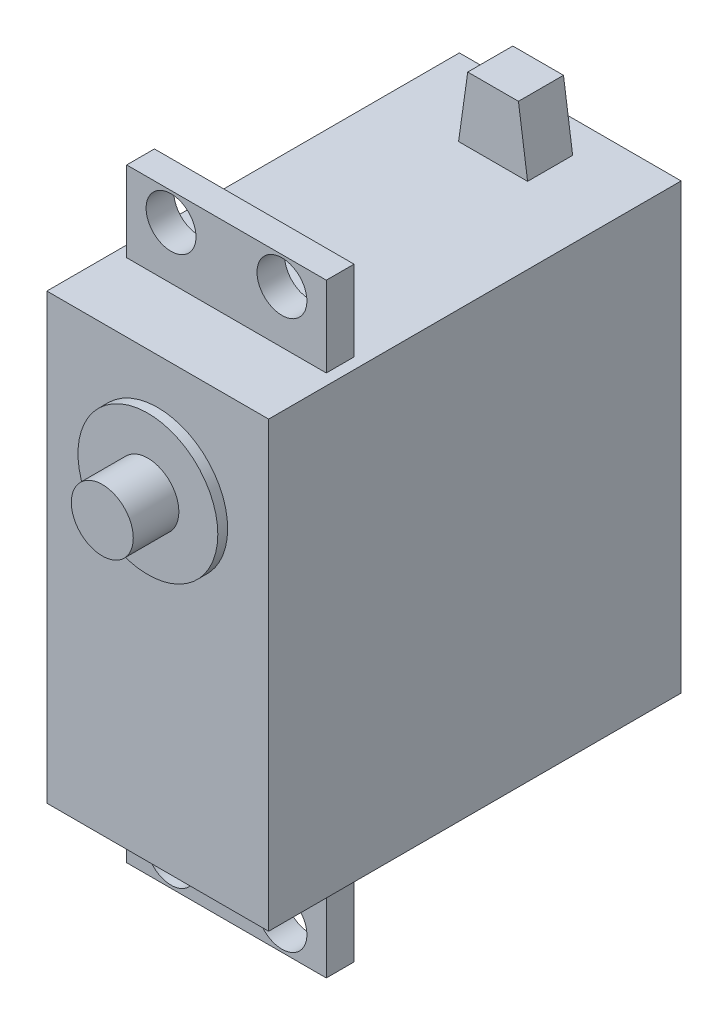
ISO-10303-21;
HEADER;
FILE_DESCRIPTION(('STEP AP214'),'2;1');
FILE_NAME('part.step','',(''),(''),'','','');
FILE_SCHEMA(('AUTOMOTIVE_DESIGN { 1 0 10303 214 1 1 1 1 }'));
ENDSEC;
DATA;
#1=APPLICATION_CONTEXT('core data for automotive mechanical design processes');
#2=APPLICATION_PROTOCOL_DEFINITION('international standard','automotive_design',2000,#1);
#3=PRODUCT_CONTEXT('',#1,'mechanical');
#4=PRODUCT('Part','Part','',(#3));
#5=PRODUCT_RELATED_PRODUCT_CATEGORY('part','',(#4));
#6=PRODUCT_DEFINITION_FORMATION('','',#4);
#7=PRODUCT_DEFINITION_CONTEXT('part definition',#1,'design');
#8=PRODUCT_DEFINITION('design','',#6,#7);
#9=PRODUCT_DEFINITION_SHAPE('','',#8);
#10=(LENGTH_UNIT() NAMED_UNIT(*) SI_UNIT(.MILLI.,.METRE.));
#11=(NAMED_UNIT(*) PLANE_ANGLE_UNIT() SI_UNIT($,.RADIAN.));
#12=(NAMED_UNIT(*) SI_UNIT($,.STERADIAN.) SOLID_ANGLE_UNIT());
#13=UNCERTAINTY_MEASURE_WITH_UNIT(LENGTH_MEASURE(1.E-05),#10,'distance_accuracy_value','');
#14=(GEOMETRIC_REPRESENTATION_CONTEXT(3) GLOBAL_UNCERTAINTY_ASSIGNED_CONTEXT((#13)) GLOBAL_UNIT_ASSIGNED_CONTEXT((#10,
#11,#12)) REPRESENTATION_CONTEXT('',''));
#15=CARTESIAN_POINT('',(0.,0.,0.));
#16=DIRECTION('',(0.,0.,1.));
#17=DIRECTION('',(1.,0.,0.));
#18=AXIS2_PLACEMENT_3D('',#15,#16,#17);
#19=CARTESIAN_POINT('',(0.,0.,8.7));
#20=DIRECTION('',(0.,0.,1.));
#21=DIRECTION('',(1.,0.,0.));
#22=AXIS2_PLACEMENT_3D('',#19,#20,#21);
#23=PLANE('',#22);
#24=CARTESIAN_POINT('',(10.,29.6,8.7));
#25=DIRECTION('',(0.,0.,1.));
#26=DIRECTION('',(1.,0.,0.));
#27=AXIS2_PLACEMENT_3D('',#24,#25,#26);
#28=CIRCLE('',#27,6.30555);
#29=CARTESIAN_POINT('',(16.30555,29.6,8.7));
#30=VERTEX_POINT('',#29);
#31=EDGE_CURVE('E365',#30,#30,#28,.T.);
#32=ORIENTED_EDGE('',*,*,#31,.F.);
#33=EDGE_LOOP('',(#32));
#34=FACE_BOUND('',#33,.T.);
#35=DIRECTION('',(0.,-1.,0.));
#36=VECTOR('',#35,1.);
#37=CARTESIAN_POINT('',(0.,40.,8.7));
#38=LINE('',#37,#36);
#39=CARTESIAN_POINT('',(0.,40.,8.7));
#40=VERTEX_POINT('',#39);
#41=CARTESIAN_POINT('',(0.,0.,8.7));
#42=VERTEX_POINT('',#41);
#43=EDGE_CURVE('E270',#40,#42,#38,.T.);
#44=ORIENTED_EDGE('',*,*,#43,.T.);
#45=DIRECTION('',(1.,0.,0.));
#46=VECTOR('',#45,1.);
#47=CARTESIAN_POINT('',(0.,0.,8.7));
#48=LINE('',#47,#46);
#49=CARTESIAN_POINT('',(20.,0.,8.7));
#50=VERTEX_POINT('',#49);
#51=EDGE_CURVE('E273',#42,#50,#48,.T.);
#52=ORIENTED_EDGE('',*,*,#51,.T.);
#53=DIRECTION('',(0.,1.,0.));
#54=VECTOR('',#53,1.);
#55=CARTESIAN_POINT('',(20.,40.,8.7));
#56=LINE('',#55,#54);
#57=CARTESIAN_POINT('',(20.,40.,8.7));
#58=VERTEX_POINT('',#57);
#59=EDGE_CURVE('E275',#50,#58,#56,.T.);
#60=ORIENTED_EDGE('',*,*,#59,.T.);
#61=DIRECTION('',(-1.,0.,0.));
#62=VECTOR('',#61,1.);
#63=CARTESIAN_POINT('',(0.,40.,8.7));
#64=LINE('',#63,#62);
#65=EDGE_CURVE('E277',#58,#40,#64,.T.);
#66=ORIENTED_EDGE('',*,*,#65,.T.);
#67=EDGE_LOOP('',(#44,#52,#60,#66));
#68=FACE_BOUND('',#67,.T.);
#69=ADVANCED_FACE('F36',(#34,#68),#23,.T.);
#70=CARTESIAN_POINT('',(0.,40.,8.7));
#71=DIRECTION('',(1.,0.,0.));
#72=DIRECTION('',(0.,1.,0.));
#73=AXIS2_PLACEMENT_3D('',#70,#71,#72);
#74=PLANE('',#73);
#75=DIRECTION('',(0.,0.,-1.));
#76=VECTOR('',#75,1.);
#77=CARTESIAN_POINT('',(0.,40.,8.7));
#78=LINE('',#77,#76);
#79=CARTESIAN_POINT('',(0.,40.,-28.5));
#80=VERTEX_POINT('',#79);
#81=EDGE_CURVE('E279',#40,#80,#78,.T.);
#82=ORIENTED_EDGE('',*,*,#81,.T.);
#83=DIRECTION('',(0.,1.,0.));
#84=VECTOR('',#83,1.);
#85=CARTESIAN_POINT('',(0.,40.,-28.5));
#86=LINE('',#85,#84);
#87=CARTESIAN_POINT('',(0.,0.,-28.5));
#88=VERTEX_POINT('',#87);
#89=EDGE_CURVE('E265',#88,#80,#86,.T.);
#90=ORIENTED_EDGE('',*,*,#89,.F.);
#91=DIRECTION('',(0.,0.,-1.));
#92=VECTOR('',#91,1.);
#93=CARTESIAN_POINT('',(0.,0.,8.7));
#94=LINE('',#93,#92);
#95=EDGE_CURVE('E286',#42,#88,#94,.T.);
#96=ORIENTED_EDGE('',*,*,#95,.F.);
#97=ORIENTED_EDGE('',*,*,#43,.F.);
#98=EDGE_LOOP('',(#82,#90,#96,#97));
#99=FACE_BOUND('',#98,.T.);
#100=ADVANCED_FACE('F38',(#99),#74,.F.);
#101=CARTESIAN_POINT('',(0.,0.,8.7));
#102=DIRECTION('',(0.,1.,0.));
#103=DIRECTION('',(0.,0.,1.));
#104=AXIS2_PLACEMENT_3D('',#101,#102,#103);
#105=PLANE('',#104);
#106=DIRECTION('',(0.,0.,-1.));
#107=VECTOR('',#106,1.);
#108=CARTESIAN_POINT('',(1.,0.,2.5));
#109=LINE('',#108,#107);
#110=CARTESIAN_POINT('',(1.,0.,2.5));
#111=VERTEX_POINT('',#110);
#112=CARTESIAN_POINT('',(1.,0.,0.));
#113=VERTEX_POINT('',#112);
#114=EDGE_CURVE('E56',#111,#113,#109,.T.);
#115=ORIENTED_EDGE('',*,*,#114,.F.);
#116=DIRECTION('',(1.,0.,0.));
#117=VECTOR('',#116,1.);
#118=CARTESIAN_POINT('',(0.,0.,2.5));
#119=LINE('',#118,#117);
#120=CARTESIAN_POINT('',(19.,0.,2.5));
#121=VERTEX_POINT('',#120);
#122=EDGE_CURVE('E257',#111,#121,#119,.T.);
#123=ORIENTED_EDGE('',*,*,#122,.T.);
#124=DIRECTION('',(0.,0.,-1.));
#125=VECTOR('',#124,1.);
#126=CARTESIAN_POINT('',(19.,0.,2.5));
#127=LINE('',#126,#125);
#128=CARTESIAN_POINT('',(19.,0.,0.));
#129=VERTEX_POINT('',#128);
#130=EDGE_CURVE('E224',#121,#129,#127,.T.);
#131=ORIENTED_EDGE('',*,*,#130,.T.);
#132=DIRECTION('',(1.,0.,0.));
#133=VECTOR('',#132,1.);
#134=CARTESIAN_POINT('',(0.,0.,0.));
#135=LINE('',#134,#133);
#136=EDGE_CURVE('E52',#113,#129,#135,.T.);
#137=ORIENTED_EDGE('',*,*,#136,.F.);
#138=EDGE_LOOP('',(#115,#123,#131,#137));
#139=FACE_BOUND('',#138,.T.);
#140=ORIENTED_EDGE('',*,*,#95,.T.);
#141=DIRECTION('',(-1.,0.,0.));
#142=VECTOR('',#141,1.);
#143=CARTESIAN_POINT('',(20.,0.,-28.5));
#144=LINE('',#143,#142);
#145=CARTESIAN_POINT('',(20.,0.,-28.5));
#146=VERTEX_POINT('',#145);
#147=EDGE_CURVE('E262',#146,#88,#144,.T.);
#148=ORIENTED_EDGE('',*,*,#147,.F.);
#149=DIRECTION('',(0.,0.,-1.));
#150=VECTOR('',#149,1.);
#151=CARTESIAN_POINT('',(20.,0.,8.7));
#152=LINE('',#151,#150);
#153=EDGE_CURVE('E284',#50,#146,#152,.T.);
#154=ORIENTED_EDGE('',*,*,#153,.F.);
#155=ORIENTED_EDGE('',*,*,#51,.F.);
#156=EDGE_LOOP('',(#140,#148,#154,#155));
#157=FACE_BOUND('',#156,.T.);
#158=ADVANCED_FACE('F332',(#139,#157),#105,.F.);
#159=CARTESIAN_POINT('',(20.,40.,8.7));
#160=DIRECTION('',(-1.,0.,0.));
#161=DIRECTION('',(0.,0.,1.));
#162=AXIS2_PLACEMENT_3D('',#159,#160,#161);
#163=PLANE('',#162);
#164=ORIENTED_EDGE('',*,*,#153,.T.);
#165=DIRECTION('',(0.,-1.,0.));
#166=VECTOR('',#165,1.);
#167=CARTESIAN_POINT('',(20.,40.,-28.5));
#168=LINE('',#167,#166);
#169=CARTESIAN_POINT('',(20.,40.,-28.5));
#170=VERTEX_POINT('',#169);
#171=EDGE_CURVE('E259',#170,#146,#168,.T.);
#172=ORIENTED_EDGE('',*,*,#171,.F.);
#173=DIRECTION('',(0.,0.,-1.));
#174=VECTOR('',#173,1.);
#175=CARTESIAN_POINT('',(20.,40.,8.7));
#176=LINE('',#175,#174);
#177=EDGE_CURVE('E281',#58,#170,#176,.T.);
#178=ORIENTED_EDGE('',*,*,#177,.F.);
#179=ORIENTED_EDGE('',*,*,#59,.F.);
#180=EDGE_LOOP('',(#164,#172,#178,#179));
#181=FACE_BOUND('',#180,.T.);
#182=ADVANCED_FACE('F342',(#181),#163,.F.);
#183=CARTESIAN_POINT('',(0.,40.,8.7));
#184=DIRECTION('',(0.,-1.,0.));
#185=DIRECTION('',(1.,0.,0.));
#186=AXIS2_PLACEMENT_3D('',#183,#184,#185);
#187=PLANE('',#186);
#188=ORIENTED_EDGE('',*,*,#177,.T.);
#189=DIRECTION('',(1.,0.,0.));
#190=VECTOR('',#189,1.);
#191=CARTESIAN_POINT('',(20.,40.,-28.5));
#192=LINE('',#191,#190);
#193=EDGE_CURVE('E268',#80,#170,#192,.T.);
#194=ORIENTED_EDGE('',*,*,#193,.F.);
#195=ORIENTED_EDGE('',*,*,#81,.F.);
#196=ORIENTED_EDGE('',*,*,#65,.F.);
#197=EDGE_LOOP('',(#188,#194,#195,#196));
#198=FACE_BOUND('',#197,.T.);
#199=DIRECTION('',(-1.,0.,0.));
#200=VECTOR('',#199,1.);
#201=CARTESIAN_POINT('',(6.8885,40.,-25.6044));
#202=LINE('',#201,#200);
#203=CARTESIAN_POINT('',(13.1115,40.,-25.6044));
#204=VERTEX_POINT('',#203);
#205=CARTESIAN_POINT('',(6.8885,40.,-25.6044));
#206=VERTEX_POINT('',#205);
#207=EDGE_CURVE('E165',#204,#206,#202,.T.);
#208=ORIENTED_EDGE('',*,*,#207,.F.);
#209=DIRECTION('',(0.,0.,-1.));
#210=VECTOR('',#209,1.);
#211=CARTESIAN_POINT('',(13.1115,40.,-21.5404));
#212=LINE('',#211,#210);
#213=CARTESIAN_POINT('',(13.1115,40.,-21.5404));
#214=VERTEX_POINT('',#213);
#215=EDGE_CURVE('E164',#214,#204,#212,.T.);
#216=ORIENTED_EDGE('',*,*,#215,.F.);
#217=DIRECTION('',(-1.,0.,0.));
#218=VECTOR('',#217,1.);
#219=CARTESIAN_POINT('',(13.1115,40.,-21.5404));
#220=LINE('',#219,#218);
#221=CARTESIAN_POINT('',(6.8885,40.,-21.5404));
#222=VERTEX_POINT('',#221);
#223=EDGE_CURVE('E375',#214,#222,#220,.T.);
#224=ORIENTED_EDGE('',*,*,#223,.T.);
#225=DIRECTION('',(0.,0.,-1.));
#226=VECTOR('',#225,1.);
#227=CARTESIAN_POINT('',(6.8885,40.,-21.5404));
#228=LINE('',#227,#226);
#229=EDGE_CURVE('E177',#222,#206,#228,.T.);
#230=ORIENTED_EDGE('',*,*,#229,.T.);
#231=EDGE_LOOP('',(#208,#216,#224,#230));
#232=FACE_BOUND('',#231,.T.);
#233=DIRECTION('',(0.,0.,-1.));
#234=VECTOR('',#233,1.);
#235=CARTESIAN_POINT('',(19.,40.,2.5));
#236=LINE('',#235,#234);
#237=CARTESIAN_POINT('',(19.,40.,2.5));
#238=VERTEX_POINT('',#237);
#239=CARTESIAN_POINT('',(19.,40.,0.));
#240=VERTEX_POINT('',#239);
#241=EDGE_CURVE('E253',#238,#240,#236,.T.);
#242=ORIENTED_EDGE('',*,*,#241,.F.);
#243=DIRECTION('',(-1.,0.,0.));
#244=VECTOR('',#243,1.);
#245=CARTESIAN_POINT('',(0.,40.,2.5));
#246=LINE('',#245,#244);
#247=CARTESIAN_POINT('',(0.999999999999999,40.,2.5));
#248=VERTEX_POINT('',#247);
#249=EDGE_CURVE('E12',#238,#248,#246,.T.);
#250=ORIENTED_EDGE('',*,*,#249,.T.);
#251=DIRECTION('',(0.,0.,-1.));
#252=VECTOR('',#251,1.);
#253=CARTESIAN_POINT('',(0.999999999999999,40.,2.5));
#254=LINE('',#253,#252);
#255=CARTESIAN_POINT('',(0.999999999999999,40.,0.));
#256=VERTEX_POINT('',#255);
#257=EDGE_CURVE('E245',#248,#256,#254,.T.);
#258=ORIENTED_EDGE('',*,*,#257,.T.);
#259=DIRECTION('',(-1.,0.,0.));
#260=VECTOR('',#259,1.);
#261=CARTESIAN_POINT('',(0.,40.,0.));
#262=LINE('',#261,#260);
#263=EDGE_CURVE('E45',#240,#256,#262,.T.);
#264=ORIENTED_EDGE('',*,*,#263,.F.);
#265=EDGE_LOOP('',(#242,#250,#258,#264));
#266=FACE_BOUND('',#265,.T.);
#267=ADVANCED_FACE('F308',(#198,#232,#266),#187,.F.);
#268=CARTESIAN_POINT('',(0.,0.,-28.5));
#269=DIRECTION('',(0.,0.,-1.));
#270=DIRECTION('',(-1.,0.,0.));
#271=AXIS2_PLACEMENT_3D('',#268,#269,#270);
#272=PLANE('',#271);
#273=ORIENTED_EDGE('',*,*,#193,.T.);
#274=ORIENTED_EDGE('',*,*,#171,.T.);
#275=ORIENTED_EDGE('',*,*,#147,.T.);
#276=ORIENTED_EDGE('',*,*,#89,.T.);
#277=EDGE_LOOP('',(#273,#274,#275,#276));
#278=FACE_BOUND('',#277,.T.);
#279=ADVANCED_FACE('F338',(#278),#272,.T.);
#280=CARTESIAN_POINT('',(5.,44.75,2.5));
#281=DIRECTION('',(0.,0.,-1.));
#282=DIRECTION('',(-1.,0.,0.));
#283=AXIS2_PLACEMENT_3D('',#280,#281,#282);
#284=CYLINDRICAL_SURFACE('',#283,2.25);
#285=CARTESIAN_POINT('',(5.,44.75,2.5));
#286=DIRECTION('',(0.,0.,1.));
#287=DIRECTION('',(1.,0.,0.));
#288=AXIS2_PLACEMENT_3D('',#285,#286,#287);
#289=CIRCLE('',#288,2.25);
#290=CARTESIAN_POINT('',(7.25,44.75,2.5));
#291=VERTEX_POINT('',#290);
#292=EDGE_CURVE('E191',#291,#291,#289,.T.);
#293=ORIENTED_EDGE('',*,*,#292,.T.);
#294=EDGE_LOOP('',(#293));
#295=FACE_BOUND('',#294,.T.);
#296=CARTESIAN_POINT('',(5.,44.75,0.));
#297=DIRECTION('',(0.,0.,1.));
#298=DIRECTION('',(1.,0.,0.));
#299=AXIS2_PLACEMENT_3D('',#296,#297,#298);
#300=CIRCLE('',#299,2.25);
#301=CARTESIAN_POINT('',(7.25,44.75,0.));
#302=VERTEX_POINT('',#301);
#303=EDGE_CURVE('E188',#302,#302,#300,.T.);
#304=ORIENTED_EDGE('',*,*,#303,.F.);
#305=EDGE_LOOP('',(#304));
#306=FACE_BOUND('',#305,.T.);
#307=ADVANCED_FACE('F412',(#295,#306),#284,.F.);
#308=CARTESIAN_POINT('',(15.,44.75,2.5));
#309=DIRECTION('',(0.,0.,-1.));
#310=DIRECTION('',(-1.,0.,0.));
#311=AXIS2_PLACEMENT_3D('',#308,#309,#310);
#312=CYLINDRICAL_SURFACE('',#311,2.25);
#313=CARTESIAN_POINT('',(15.,44.75,2.5));
#314=DIRECTION('',(0.,0.,1.));
#315=DIRECTION('',(1.,0.,0.));
#316=AXIS2_PLACEMENT_3D('',#313,#314,#315);
#317=CIRCLE('',#316,2.25);
#318=CARTESIAN_POINT('',(17.25,44.75,2.5));
#319=VERTEX_POINT('',#318);
#320=EDGE_CURVE('E185',#319,#319,#317,.T.);
#321=ORIENTED_EDGE('',*,*,#320,.T.);
#322=EDGE_LOOP('',(#321));
#323=FACE_BOUND('',#322,.T.);
#324=CARTESIAN_POINT('',(15.,44.75,0.));
#325=DIRECTION('',(0.,0.,1.));
#326=DIRECTION('',(1.,0.,0.));
#327=AXIS2_PLACEMENT_3D('',#324,#325,#326);
#328=CIRCLE('',#327,2.25);
#329=CARTESIAN_POINT('',(17.25,44.75,0.));
#330=VERTEX_POINT('',#329);
#331=EDGE_CURVE('E175',#330,#330,#328,.T.);
#332=ORIENTED_EDGE('',*,*,#331,.F.);
#333=EDGE_LOOP('',(#332));
#334=FACE_BOUND('',#333,.T.);
#335=ADVANCED_FACE('F409',(#323,#334),#312,.F.);
#336=CARTESIAN_POINT('',(1.,47.25,2.5));
#337=DIRECTION('',(0.,-1.,0.));
#338=DIRECTION('',(0.,0.,-1.));
#339=AXIS2_PLACEMENT_3D('',#336,#337,#338);
#340=PLANE('',#339);
#341=DIRECTION('',(-1.,0.,0.));
#342=VECTOR('',#341,1.);
#343=CARTESIAN_POINT('',(1.,47.25,0.));
#344=LINE('',#343,#342);
#345=CARTESIAN_POINT('',(19.,47.25,0.));
#346=VERTEX_POINT('',#345);
#347=CARTESIAN_POINT('',(1.,47.25,0.));
#348=VERTEX_POINT('',#347);
#349=EDGE_CURVE('E226',#346,#348,#344,.T.);
#350=ORIENTED_EDGE('',*,*,#349,.T.);
#351=DIRECTION('',(0.,0.,-1.));
#352=VECTOR('',#351,1.);
#353=CARTESIAN_POINT('',(1.,47.25,2.5));
#354=LINE('',#353,#352);
#355=CARTESIAN_POINT('',(1.,47.25,2.5));
#356=VERTEX_POINT('',#355);
#357=EDGE_CURVE('E247',#356,#348,#354,.T.);
#358=ORIENTED_EDGE('',*,*,#357,.F.);
#359=DIRECTION('',(-1.,0.,0.));
#360=VECTOR('',#359,1.);
#361=CARTESIAN_POINT('',(1.,47.25,2.5));
#362=LINE('',#361,#360);
#363=CARTESIAN_POINT('',(19.,47.25,2.5));
#364=VERTEX_POINT('',#363);
#365=EDGE_CURVE('E211',#364,#356,#362,.T.);
#366=ORIENTED_EDGE('',*,*,#365,.F.);
#367=DIRECTION('',(0.,0.,-1.));
#368=VECTOR('',#367,1.);
#369=CARTESIAN_POINT('',(19.,47.25,2.5));
#370=LINE('',#369,#368);
#371=EDGE_CURVE('E250',#364,#346,#370,.T.);
#372=ORIENTED_EDGE('',*,*,#371,.T.);
#373=EDGE_LOOP('',(#350,#358,#366,#372));
#374=FACE_BOUND('',#373,.T.);
#375=ADVANCED_FACE('F302',(#374),#340,.F.);
#376=CARTESIAN_POINT('',(1.,47.25,2.5));
#377=DIRECTION('',(1.,0.,0.));
#378=DIRECTION('',(0.,1.,0.));
#379=AXIS2_PLACEMENT_3D('',#376,#377,#378);
#380=PLANE('',#379);
#381=DIRECTION('',(0.,-1.,0.));
#382=VECTOR('',#381,1.);
#383=CARTESIAN_POINT('',(1.,47.25,0.));
#384=LINE('',#383,#382);
#385=EDGE_CURVE('E228',#348,#256,#384,.T.);
#386=ORIENTED_EDGE('',*,*,#385,.T.);
#387=ORIENTED_EDGE('',*,*,#257,.F.);
#388=DIRECTION('',(0.,-1.,0.));
#389=VECTOR('',#388,1.);
#390=CARTESIAN_POINT('',(1.,47.25,2.5));
#391=LINE('',#390,#389);
#392=EDGE_CURVE('E214',#356,#248,#391,.T.);
#393=ORIENTED_EDGE('',*,*,#392,.F.);
#394=ORIENTED_EDGE('',*,*,#357,.T.);
#395=EDGE_LOOP('',(#386,#387,#393,#394));
#396=FACE_BOUND('',#395,.T.);
#397=ADVANCED_FACE('F297',(#396),#380,.F.);
#398=CARTESIAN_POINT('',(19.,47.25,2.5));
#399=DIRECTION('',(-1.,0.,0.));
#400=DIRECTION('',(0.,-1.,0.));
#401=AXIS2_PLACEMENT_3D('',#398,#399,#400);
#402=PLANE('',#401);
#403=DIRECTION('',(0.,1.,0.));
#404=VECTOR('',#403,1.);
#405=CARTESIAN_POINT('',(19.,47.25,0.));
#406=LINE('',#405,#404);
#407=EDGE_CURVE('E206',#240,#346,#406,.T.);
#408=ORIENTED_EDGE('',*,*,#407,.T.);
#409=ORIENTED_EDGE('',*,*,#371,.F.);
#410=DIRECTION('',(0.,1.,0.));
#411=VECTOR('',#410,1.);
#412=CARTESIAN_POINT('',(19.,47.25,2.5));
#413=LINE('',#412,#411);
#414=EDGE_CURVE('E209',#238,#364,#413,.T.);
#415=ORIENTED_EDGE('',*,*,#414,.F.);
#416=ORIENTED_EDGE('',*,*,#241,.T.);
#417=EDGE_LOOP('',(#408,#409,#415,#416));
#418=FACE_BOUND('',#417,.T.);
#419=ADVANCED_FACE('F306',(#418),#402,.F.);
#420=CARTESIAN_POINT('',(0.,0.,0.));
#421=DIRECTION('',(0.,0.,1.));
#422=DIRECTION('',(1.,0.,0.));
#423=AXIS2_PLACEMENT_3D('',#420,#421,#422);
#424=PLANE('',#423);
#425=ORIENTED_EDGE('',*,*,#331,.T.);
#426=EDGE_LOOP('',(#425));
#427=FACE_BOUND('',#426,.T.);
#428=ORIENTED_EDGE('',*,*,#303,.T.);
#429=EDGE_LOOP('',(#428));
#430=FACE_BOUND('',#429,.T.);
#431=ORIENTED_EDGE('',*,*,#407,.F.);
#432=ORIENTED_EDGE('',*,*,#263,.T.);
#433=ORIENTED_EDGE('',*,*,#385,.F.);
#434=ORIENTED_EDGE('',*,*,#349,.F.);
#435=EDGE_LOOP('',(#431,#432,#433,#434));
#436=FACE_BOUND('',#435,.T.);
#437=ADVANCED_FACE('F292',(#427,#430,#436),#424,.F.);
#438=CARTESIAN_POINT('',(0.,0.,2.5));
#439=DIRECTION('',(0.,0.,1.));
#440=DIRECTION('',(1.,0.,0.));
#441=AXIS2_PLACEMENT_3D('',#438,#439,#440);
#442=PLANE('',#441);
#443=ORIENTED_EDGE('',*,*,#320,.F.);
#444=EDGE_LOOP('',(#443));
#445=FACE_BOUND('',#444,.T.);
#446=ORIENTED_EDGE('',*,*,#292,.F.);
#447=EDGE_LOOP('',(#446));
#448=FACE_BOUND('',#447,.T.);
#449=ORIENTED_EDGE('',*,*,#249,.F.);
#450=ORIENTED_EDGE('',*,*,#414,.T.);
#451=ORIENTED_EDGE('',*,*,#365,.T.);
#452=ORIENTED_EDGE('',*,*,#392,.T.);
#453=EDGE_LOOP('',(#449,#450,#451,#452));
#454=FACE_BOUND('',#453,.T.);
#455=ADVANCED_FACE('F310',(#445,#448,#454),#442,.T.);
#456=CARTESIAN_POINT('',(15.,-4.75,2.5));
#457=DIRECTION('',(0.,0.,1.));
#458=DIRECTION('',(1.,0.,0.));
#459=AXIS2_PLACEMENT_3D('',#456,#457,#458);
#460=CIRCLE('',#459,2.25);
#461=CARTESIAN_POINT('',(17.25,-4.75,2.5));
#462=VERTEX_POINT('',#461);
#463=EDGE_CURVE('E197',#462,#462,#460,.T.);
#464=ORIENTED_EDGE('',*,*,#463,.F.);
#465=EDGE_LOOP('',(#464));
#466=FACE_BOUND('',#465,.T.);
#467=CARTESIAN_POINT('',(5.,-4.75,2.5));
#468=DIRECTION('',(0.,0.,1.));
#469=DIRECTION('',(1.,0.,0.));
#470=AXIS2_PLACEMENT_3D('',#467,#468,#469);
#471=CIRCLE('',#470,2.25);
#472=CARTESIAN_POINT('',(7.25,-4.75,2.5));
#473=VERTEX_POINT('',#472);
#474=EDGE_CURVE('E203',#473,#473,#471,.T.);
#475=ORIENTED_EDGE('',*,*,#474,.F.);
#476=EDGE_LOOP('',(#475));
#477=FACE_BOUND('',#476,.T.);
#478=ORIENTED_EDGE('',*,*,#122,.F.);
#479=DIRECTION('',(0.,-1.,0.));
#480=VECTOR('',#479,1.);
#481=CARTESIAN_POINT('',(1.,0.,2.5));
#482=LINE('',#481,#480);
#483=CARTESIAN_POINT('',(0.999999999999999,-7.25,2.5));
#484=VERTEX_POINT('',#483);
#485=EDGE_CURVE('E217',#111,#484,#482,.T.);
#486=ORIENTED_EDGE('',*,*,#485,.T.);
#487=DIRECTION('',(1.,0.,0.));
#488=VECTOR('',#487,1.);
#489=CARTESIAN_POINT('',(0.999999999999999,-7.25,2.5));
#490=LINE('',#489,#488);
#491=CARTESIAN_POINT('',(19.,-7.25,2.5));
#492=VERTEX_POINT('',#491);
#493=EDGE_CURVE('E219',#484,#492,#490,.T.);
#494=ORIENTED_EDGE('',*,*,#493,.T.);
#495=DIRECTION('',(0.,1.,0.));
#496=VECTOR('',#495,1.);
#497=CARTESIAN_POINT('',(19.,0.,2.5));
#498=LINE('',#497,#496);
#499=EDGE_CURVE('E221',#492,#121,#498,.T.);
#500=ORIENTED_EDGE('',*,*,#499,.T.);
#501=EDGE_LOOP('',(#478,#486,#494,#500));
#502=FACE_BOUND('',#501,.T.);
#503=ADVANCED_FACE('F312',(#466,#477,#502),#442,.T.);
#504=CARTESIAN_POINT('',(5.,-4.75,0.));
#505=DIRECTION('',(0.,0.,1.));
#506=DIRECTION('',(1.,0.,0.));
#507=AXIS2_PLACEMENT_3D('',#504,#505,#506);
#508=CIRCLE('',#507,2.25);
#509=CARTESIAN_POINT('',(7.25,-4.75,0.));
#510=VERTEX_POINT('',#509);
#511=EDGE_CURVE('E200',#510,#510,#508,.T.);
#512=ORIENTED_EDGE('',*,*,#511,.T.);
#513=EDGE_LOOP('',(#512));
#514=FACE_BOUND('',#513,.T.);
#515=CARTESIAN_POINT('',(15.,-4.75,0.));
#516=DIRECTION('',(0.,0.,1.));
#517=DIRECTION('',(1.,0.,0.));
#518=AXIS2_PLACEMENT_3D('',#515,#516,#517);
#519=CIRCLE('',#518,2.25);
#520=CARTESIAN_POINT('',(17.25,-4.75,0.));
#521=VERTEX_POINT('',#520);
#522=EDGE_CURVE('E194',#521,#521,#519,.T.);
#523=ORIENTED_EDGE('',*,*,#522,.T.);
#524=EDGE_LOOP('',(#523));
#525=FACE_BOUND('',#524,.T.);
#526=DIRECTION('',(0.,-1.,0.));
#527=VECTOR('',#526,1.);
#528=CARTESIAN_POINT('',(1.,0.,0.));
#529=LINE('',#528,#527);
#530=CARTESIAN_POINT('',(0.999999999999999,-7.25,0.));
#531=VERTEX_POINT('',#530);
#532=EDGE_CURVE('E231',#113,#531,#529,.T.);
#533=ORIENTED_EDGE('',*,*,#532,.F.);
#534=ORIENTED_EDGE('',*,*,#136,.T.);
#535=DIRECTION('',(0.,1.,0.));
#536=VECTOR('',#535,1.);
#537=CARTESIAN_POINT('',(19.,0.,0.));
#538=LINE('',#537,#536);
#539=CARTESIAN_POINT('',(19.,-7.25,0.));
#540=VERTEX_POINT('',#539);
#541=EDGE_CURVE('E212',#540,#129,#538,.T.);
#542=ORIENTED_EDGE('',*,*,#541,.F.);
#543=DIRECTION('',(1.,0.,0.));
#544=VECTOR('',#543,1.);
#545=CARTESIAN_POINT('',(0.999999999999999,-7.25,0.));
#546=LINE('',#545,#544);
#547=EDGE_CURVE('E233',#531,#540,#546,.T.);
#548=ORIENTED_EDGE('',*,*,#547,.F.);
#549=EDGE_LOOP('',(#533,#534,#542,#548));
#550=FACE_BOUND('',#549,.T.);
#551=ADVANCED_FACE('F319',(#514,#525,#550),#424,.F.);
#552=CARTESIAN_POINT('',(1.,0.,2.5));
#553=DIRECTION('',(1.,0.,0.));
#554=DIRECTION('',(0.,1.,0.));
#555=AXIS2_PLACEMENT_3D('',#552,#553,#554);
#556=PLANE('',#555);
#557=ORIENTED_EDGE('',*,*,#532,.T.);
#558=DIRECTION('',(0.,0.,-1.));
#559=VECTOR('',#558,1.);
#560=CARTESIAN_POINT('',(0.999999999999999,-7.25,2.5));
#561=LINE('',#560,#559);
#562=EDGE_CURVE('E241',#484,#531,#561,.T.);
#563=ORIENTED_EDGE('',*,*,#562,.F.);
#564=ORIENTED_EDGE('',*,*,#485,.F.);
#565=ORIENTED_EDGE('',*,*,#114,.T.);
#566=EDGE_LOOP('',(#557,#563,#564,#565));
#567=FACE_BOUND('',#566,.T.);
#568=ADVANCED_FACE('F435',(#567),#556,.F.);
#569=CARTESIAN_POINT('',(0.999999999999999,-7.25,2.5));
#570=DIRECTION('',(0.,1.,0.));
#571=DIRECTION('',(0.,0.,1.));
#572=AXIS2_PLACEMENT_3D('',#569,#570,#571);
#573=PLANE('',#572);
#574=ORIENTED_EDGE('',*,*,#547,.T.);
#575=DIRECTION('',(0.,0.,-1.));
#576=VECTOR('',#575,1.);
#577=CARTESIAN_POINT('',(19.,-7.25,2.5));
#578=LINE('',#577,#576);
#579=EDGE_CURVE('E238',#492,#540,#578,.T.);
#580=ORIENTED_EDGE('',*,*,#579,.F.);
#581=ORIENTED_EDGE('',*,*,#493,.F.);
#582=ORIENTED_EDGE('',*,*,#562,.T.);
#583=EDGE_LOOP('',(#574,#580,#581,#582));
#584=FACE_BOUND('',#583,.T.);
#585=ADVANCED_FACE('F426',(#584),#573,.F.);
#586=CARTESIAN_POINT('',(19.,0.,2.5));
#587=DIRECTION('',(-1.,0.,0.));
#588=DIRECTION('',(0.,0.,1.));
#589=AXIS2_PLACEMENT_3D('',#586,#587,#588);
#590=PLANE('',#589);
#591=ORIENTED_EDGE('',*,*,#541,.T.);
#592=ORIENTED_EDGE('',*,*,#130,.F.);
#593=ORIENTED_EDGE('',*,*,#499,.F.);
#594=ORIENTED_EDGE('',*,*,#579,.T.);
#595=EDGE_LOOP('',(#591,#592,#593,#594));
#596=FACE_BOUND('',#595,.T.);
#597=ADVANCED_FACE('F421',(#596),#590,.F.);
#598=CARTESIAN_POINT('',(5.,-4.75,2.5));
#599=DIRECTION('',(0.,0.,-1.));
#600=DIRECTION('',(-1.,0.,0.));
#601=AXIS2_PLACEMENT_3D('',#598,#599,#600);
#602=CYLINDRICAL_SURFACE('',#601,2.25);
#603=ORIENTED_EDGE('',*,*,#474,.T.);
#604=EDGE_LOOP('',(#603));
#605=FACE_BOUND('',#604,.T.);
#606=ORIENTED_EDGE('',*,*,#511,.F.);
#607=EDGE_LOOP('',(#606));
#608=FACE_BOUND('',#607,.T.);
#609=ADVANCED_FACE('F418',(#605,#608),#602,.F.);
#610=CARTESIAN_POINT('',(15.,-4.75,2.5));
#611=DIRECTION('',(0.,0.,-1.));
#612=DIRECTION('',(-1.,0.,0.));
#613=AXIS2_PLACEMENT_3D('',#610,#611,#612);
#614=CYLINDRICAL_SURFACE('',#613,2.25);
#615=ORIENTED_EDGE('',*,*,#463,.T.);
#616=EDGE_LOOP('',(#615));
#617=FACE_BOUND('',#616,.T.);
#618=ORIENTED_EDGE('',*,*,#522,.F.);
#619=EDGE_LOOP('',(#618));
#620=FACE_BOUND('',#619,.T.);
#621=ADVANCED_FACE('F400',(#617,#620),#614,.F.);
#622=CARTESIAN_POINT('',(13.1115,40.,-21.5404));
#623=DIRECTION('',(0.990163599913086,0.139914421726849,0.));
#624=DIRECTION('',(-0.139914421726849,0.990163599913086,0.));
#625=AXIS2_PLACEMENT_3D('',#622,#623,#624);
#626=PLANE('',#625);
#627=DIRECTION('',(0.139914421726849,-0.990163599913086,0.));
#628=VECTOR('',#627,1.);
#629=CARTESIAN_POINT('',(13.1115,40.,-25.6044));
#630=LINE('',#629,#628);
#631=CARTESIAN_POINT('',(12.286,45.842,-25.6044));
#632=VERTEX_POINT('',#631);
#633=EDGE_CURVE('E150',#632,#204,#630,.T.);
#634=ORIENTED_EDGE('',*,*,#633,.F.);
#635=DIRECTION('',(0.,0.,-1.));
#636=VECTOR('',#635,1.);
#637=CARTESIAN_POINT('',(12.286,45.842,-21.5404));
#638=LINE('',#637,#636);
#639=CARTESIAN_POINT('',(12.286,45.842,-21.5404));
#640=VERTEX_POINT('',#639);
#641=EDGE_CURVE('E161',#640,#632,#638,.T.);
#642=ORIENTED_EDGE('',*,*,#641,.F.);
#643=DIRECTION('',(0.139914421726849,-0.990163599913086,0.));
#644=VECTOR('',#643,1.);
#645=CARTESIAN_POINT('',(13.1115,40.,-21.5404));
#646=LINE('',#645,#644);
#647=EDGE_CURVE('E373',#640,#214,#646,.T.);
#648=ORIENTED_EDGE('',*,*,#647,.T.);
#649=ORIENTED_EDGE('',*,*,#215,.T.);
#650=EDGE_LOOP('',(#634,#642,#648,#649));
#651=FACE_BOUND('',#650,.T.);
#652=ADVANCED_FACE('F159',(#651),#626,.T.);
#653=CARTESIAN_POINT('',(12.286,45.842,-21.5404));
#654=DIRECTION('',(0.,1.,0.));
#655=DIRECTION('',(0.,0.,1.));
#656=AXIS2_PLACEMENT_3D('',#653,#654,#655);
#657=PLANE('',#656);
#658=DIRECTION('',(1.,0.,0.));
#659=VECTOR('',#658,1.);
#660=CARTESIAN_POINT('',(12.286,45.842,-25.6044));
#661=LINE('',#660,#659);
#662=CARTESIAN_POINT('',(7.714,45.842,-25.6044));
#663=VERTEX_POINT('',#662);
#664=EDGE_CURVE('E147',#663,#632,#661,.T.);
#665=ORIENTED_EDGE('',*,*,#664,.F.);
#666=DIRECTION('',(0.,0.,-1.));
#667=VECTOR('',#666,1.);
#668=CARTESIAN_POINT('',(7.714,45.842,-21.5404));
#669=LINE('',#668,#667);
#670=CARTESIAN_POINT('',(7.714,45.842,-21.5404));
#671=VERTEX_POINT('',#670);
#672=EDGE_CURVE('E172',#671,#663,#669,.T.);
#673=ORIENTED_EDGE('',*,*,#672,.F.);
#674=DIRECTION('',(1.,0.,0.));
#675=VECTOR('',#674,1.);
#676=CARTESIAN_POINT('',(12.286,45.842,-21.5404));
#677=LINE('',#676,#675);
#678=EDGE_CURVE('E170',#671,#640,#677,.T.);
#679=ORIENTED_EDGE('',*,*,#678,.T.);
#680=ORIENTED_EDGE('',*,*,#641,.T.);
#681=EDGE_LOOP('',(#665,#673,#679,#680));
#682=FACE_BOUND('',#681,.T.);
#683=ADVANCED_FACE('F168',(#682),#657,.T.);
#684=CARTESIAN_POINT('',(6.8885,40.,-21.5404));
#685=DIRECTION('',(-0.990163599913086,0.139914421726849,0.));
#686=DIRECTION('',(-0.139914421726849,-0.990163599913086,0.));
#687=AXIS2_PLACEMENT_3D('',#684,#685,#686);
#688=PLANE('',#687);
#689=DIRECTION('',(0.139914421726849,0.990163599913086,0.));
#690=VECTOR('',#689,1.);
#691=CARTESIAN_POINT('',(7.714,45.842,-25.6044));
#692=LINE('',#691,#690);
#693=EDGE_CURVE('E153',#206,#663,#692,.T.);
#694=ORIENTED_EDGE('',*,*,#693,.F.);
#695=ORIENTED_EDGE('',*,*,#229,.F.);
#696=DIRECTION('',(0.139914421726849,0.990163599913086,0.));
#697=VECTOR('',#696,1.);
#698=CARTESIAN_POINT('',(6.8885,40.,-21.5404));
#699=LINE('',#698,#697);
#700=EDGE_CURVE('E376',#222,#671,#699,.T.);
#701=ORIENTED_EDGE('',*,*,#700,.T.);
#702=ORIENTED_EDGE('',*,*,#672,.T.);
#703=EDGE_LOOP('',(#694,#695,#701,#702));
#704=FACE_BOUND('',#703,.T.);
#705=ADVANCED_FACE('F380',(#704),#688,.T.);
#706=CARTESIAN_POINT('',(0.,0.,-21.5404));
#707=DIRECTION('',(0.,0.,1.));
#708=DIRECTION('',(1.,0.,0.));
#709=AXIS2_PLACEMENT_3D('',#706,#707,#708);
#710=PLANE('',#709);
#711=ORIENTED_EDGE('',*,*,#647,.F.);
#712=ORIENTED_EDGE('',*,*,#678,.F.);
#713=ORIENTED_EDGE('',*,*,#700,.F.);
#714=ORIENTED_EDGE('',*,*,#223,.F.);
#715=EDGE_LOOP('',(#711,#712,#713,#714));
#716=FACE_BOUND('',#715,.T.);
#717=ADVANCED_FACE('F382',(#716),#710,.T.);
#718=CARTESIAN_POINT('',(10.,29.6,9.589));
#719=DIRECTION('',(0.,0.,-1.));
#720=DIRECTION('',(-1.,0.,0.));
#721=AXIS2_PLACEMENT_3D('',#718,#719,#720);
#722=CYLINDRICAL_SURFACE('',#721,6.30555);
#723=CARTESIAN_POINT('',(10.,29.6,9.589));
#724=DIRECTION('',(0.,0.,1.));
#725=DIRECTION('',(1.,0.,0.));
#726=AXIS2_PLACEMENT_3D('',#723,#724,#725);
#727=CIRCLE('',#726,6.30555);
#728=CARTESIAN_POINT('',(16.30555,29.6,9.589));
#729=VERTEX_POINT('',#728);
#730=EDGE_CURVE('E368',#729,#729,#727,.T.);
#731=ORIENTED_EDGE('',*,*,#730,.F.);
#732=EDGE_LOOP('',(#731));
#733=FACE_BOUND('',#732,.T.);
#734=ORIENTED_EDGE('',*,*,#31,.T.);
#735=EDGE_LOOP('',(#734));
#736=FACE_BOUND('',#735,.T.);
#737=ADVANCED_FACE('F384',(#733,#736),#722,.T.);
#738=CARTESIAN_POINT('',(10.,29.6,9.589));
#739=DIRECTION('',(0.,0.,1.));
#740=DIRECTION('',(1.,0.,0.));
#741=AXIS2_PLACEMENT_3D('',#738,#739,#740);
#742=PLANE('',#741);
#743=CARTESIAN_POINT('',(10.,29.6,9.589));
#744=DIRECTION('',(0.,0.,1.));
#745=DIRECTION('',(1.,0.,0.));
#746=AXIS2_PLACEMENT_3D('',#743,#744,#745);
#747=CIRCLE('',#746,2.794);
#748=CARTESIAN_POINT('',(12.794,29.6,9.589));
#749=VERTEX_POINT('',#748);
#750=EDGE_CURVE('E40',#749,#749,#747,.T.);
#751=ORIENTED_EDGE('',*,*,#750,.F.);
#752=EDGE_LOOP('',(#751));
#753=FACE_BOUND('',#752,.T.);
#754=ORIENTED_EDGE('',*,*,#730,.T.);
#755=EDGE_LOOP('',(#754));
#756=FACE_BOUND('',#755,.T.);
#757=ADVANCED_FACE('F390',(#753,#756),#742,.T.);
#758=CARTESIAN_POINT('',(10.,29.6,13.7));
#759=DIRECTION('',(0.,0.,1.));
#760=DIRECTION('',(1.,0.,0.));
#761=AXIS2_PLACEMENT_3D('',#758,#759,#760);
#762=PLANE('',#761);
#763=CARTESIAN_POINT('',(10.,29.6,13.7));
#764=DIRECTION('',(0.,0.,1.));
#765=DIRECTION('',(1.,0.,0.));
#766=AXIS2_PLACEMENT_3D('',#763,#764,#765);
#767=CIRCLE('',#766,2.794);
#768=CARTESIAN_POINT('',(12.794,29.6,13.7));
#769=VERTEX_POINT('',#768);
#770=EDGE_CURVE('E171',#769,#769,#767,.T.);
#771=ORIENTED_EDGE('',*,*,#770,.T.);
#772=EDGE_LOOP('',(#771));
#773=FACE_BOUND('',#772,.T.);
#774=ADVANCED_FACE('F401',(#773),#762,.T.);
#775=CARTESIAN_POINT('',(10.,29.6,13.7));
#776=DIRECTION('',(0.,0.,-1.));
#777=DIRECTION('',(-1.,0.,0.));
#778=AXIS2_PLACEMENT_3D('',#775,#776,#777);
#779=CYLINDRICAL_SURFACE('',#778,2.794);
#780=ORIENTED_EDGE('',*,*,#750,.T.);
#781=EDGE_LOOP('',(#780));
#782=FACE_BOUND('',#781,.T.);
#783=ORIENTED_EDGE('',*,*,#770,.F.);
#784=EDGE_LOOP('',(#783));
#785=FACE_BOUND('',#784,.T.);
#786=ADVANCED_FACE('F404',(#782,#785),#779,.T.);
#787=CARTESIAN_POINT('',(0.,0.,-25.6044));
#788=DIRECTION('',(0.,0.,1.));
#789=DIRECTION('',(1.,0.,0.));
#790=AXIS2_PLACEMENT_3D('',#787,#788,#789);
#791=PLANE('',#790);
#792=ORIENTED_EDGE('',*,*,#693,.T.);
#793=ORIENTED_EDGE('',*,*,#664,.T.);
#794=ORIENTED_EDGE('',*,*,#633,.T.);
#795=ORIENTED_EDGE('',*,*,#207,.T.);
#796=EDGE_LOOP('',(#792,#793,#794,#795));
#797=FACE_BOUND('',#796,.T.);
#798=ADVANCED_FACE('F149',(#797),#791,.F.);
#799=CLOSED_SHELL('',(#69,#100,#158,#182,#267,#279,#307,#335,#375,#397,#419,#437,#455,#503,#551,
#568,#585,#597,#609,#621,#652,#683,#705,#717,#737,#757,#774,#786,#798));
#800=MANIFOLD_SOLID_BREP('B2',#799);
#801=ADVANCED_BREP_SHAPE_REPRESENTATION('',(#18,#800),#14);
#802=SHAPE_DEFINITION_REPRESENTATION(#9,#801);
ENDSEC;
END-ISO-10303-21;
